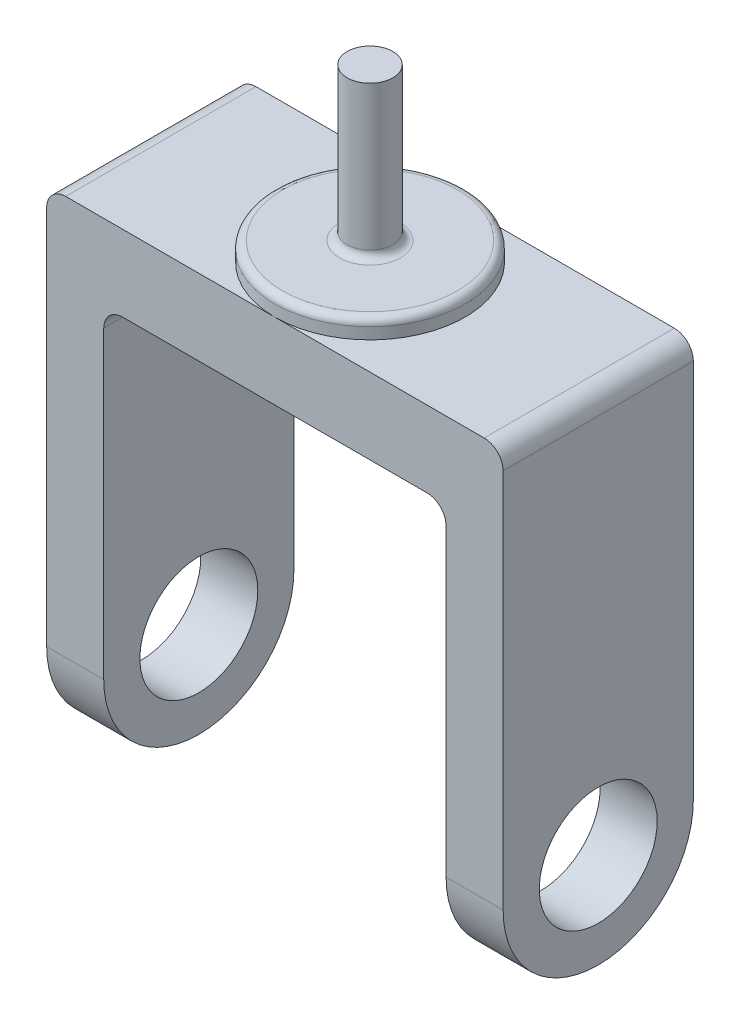
ISO-10303-21;
HEADER;
FILE_DESCRIPTION(('STEP AP214'),'2;1');
FILE_NAME('part.step','',(''),(''),'','','');
FILE_SCHEMA(('AUTOMOTIVE_DESIGN { 1 0 10303 214 1 1 1 1 }'));
ENDSEC;
DATA;
#1=APPLICATION_CONTEXT('core data for automotive mechanical design processes');
#2=APPLICATION_PROTOCOL_DEFINITION('international standard','automotive_design',2000,#1);
#3=PRODUCT_CONTEXT('',#1,'mechanical');
#4=PRODUCT('Part','Part','',(#3));
#5=PRODUCT_RELATED_PRODUCT_CATEGORY('part','',(#4));
#6=PRODUCT_DEFINITION_FORMATION('','',#4);
#7=PRODUCT_DEFINITION_CONTEXT('part definition',#1,'design');
#8=PRODUCT_DEFINITION('design','',#6,#7);
#9=PRODUCT_DEFINITION_SHAPE('','',#8);
#10=(LENGTH_UNIT() NAMED_UNIT(*) SI_UNIT(.MILLI.,.METRE.));
#11=(NAMED_UNIT(*) PLANE_ANGLE_UNIT() SI_UNIT($,.RADIAN.));
#12=(NAMED_UNIT(*) SI_UNIT($,.STERADIAN.) SOLID_ANGLE_UNIT());
#13=UNCERTAINTY_MEASURE_WITH_UNIT(LENGTH_MEASURE(1.E-05),#10,'distance_accuracy_value','');
#14=(GEOMETRIC_REPRESENTATION_CONTEXT(3) GLOBAL_UNCERTAINTY_ASSIGNED_CONTEXT((#13)) GLOBAL_UNIT_ASSIGNED_CONTEXT((#10,
#11,#12)) REPRESENTATION_CONTEXT('',''));
#15=CARTESIAN_POINT('',(0.,0.,0.));
#16=DIRECTION('',(0.,0.,1.));
#17=DIRECTION('',(1.,0.,0.));
#18=AXIS2_PLACEMENT_3D('',#15,#16,#17);
#19=CARTESIAN_POINT('',(0.,138.751233612094,50.));
#20=DIRECTION('',(0.,1.,0.));
#21=DIRECTION('',(0.,0.,1.));
#22=AXIS2_PLACEMENT_3D('',#19,#20,#21);
#23=PLANE('',#22);
#24=DIRECTION('',(1.,0.,0.));
#25=VECTOR('',#24,1.);
#26=CARTESIAN_POINT('',(0.,138.751233612094,50.));
#27=LINE('',#26,#25);
#28=CARTESIAN_POINT('',(60.,138.751233612094,50.));
#29=VERTEX_POINT('',#28);
#30=CARTESIAN_POINT('',(115.,138.751233612094,50.));
#31=VERTEX_POINT('',#30);
#32=EDGE_CURVE('E154',#29,#31,#27,.T.);
#33=ORIENTED_EDGE('',*,*,#32,.T.);
#34=DIRECTION('',(0.,0.,-1.));
#35=VECTOR('',#34,1.);
#36=CARTESIAN_POINT('',(115.,138.751233612094,0.));
#37=LINE('',#36,#35);
#38=CARTESIAN_POINT('',(115.,138.751233612094,0.));
#39=VERTEX_POINT('',#38);
#40=EDGE_CURVE('E272',#31,#39,#37,.T.);
#41=ORIENTED_EDGE('',*,*,#40,.T.);
#42=DIRECTION('',(1.,0.,0.));
#43=VECTOR('',#42,1.);
#44=CARTESIAN_POINT('',(0.,138.751233612094,0.));
#45=LINE('',#44,#43);
#46=CARTESIAN_POINT('',(60.,138.751233612094,0.));
#47=VERTEX_POINT('',#46);
#48=EDGE_CURVE('E169',#47,#39,#45,.T.);
#49=ORIENTED_EDGE('',*,*,#48,.F.);
#50=CARTESIAN_POINT('',(60.,138.751233612094,25.));
#51=DIRECTION('',(0.,1.,0.));
#52=DIRECTION('',(0.,0.,1.));
#53=AXIS2_PLACEMENT_3D('',#50,#51,#52);
#54=CIRCLE('',#53,25.);
#55=EDGE_CURVE('E167',#29,#47,#54,.T.);
#56=ORIENTED_EDGE('',*,*,#55,.F.);
#57=EDGE_LOOP('',(#33,#41,#49,#56));
#58=FACE_BOUND('',#57,.T.);
#59=ADVANCED_FACE('F35',(#58),#23,.T.);
#60=CARTESIAN_POINT('',(0.,33.7512336120935,25.));
#61=DIRECTION('',(1.,0.,0.));
#62=DIRECTION('',(0.,0.,-1.));
#63=AXIS2_PLACEMENT_3D('',#60,#61,#62);
#64=CYLINDRICAL_SURFACE('',#63,25.);
#65=DIRECTION('',(-1.,0.,0.));
#66=VECTOR('',#65,1.);
#67=CARTESIAN_POINT('',(0.,33.7512336120935,0.));
#68=LINE('',#67,#66);
#69=CARTESIAN_POINT('',(120.,33.7512336120935,0.));
#70=VERTEX_POINT('',#69);
#71=CARTESIAN_POINT('',(105.,33.7512336120935,0.));
#72=VERTEX_POINT('',#71);
#73=EDGE_CURVE('E247',#70,#72,#68,.T.);
#74=ORIENTED_EDGE('',*,*,#73,.F.);
#75=CARTESIAN_POINT('',(120.,33.7512336120935,25.));
#76=DIRECTION('',(-1.,0.,0.));
#77=DIRECTION('',(0.,0.,1.));
#78=AXIS2_PLACEMENT_3D('',#75,#76,#77);
#79=CIRCLE('',#78,25.);
#80=CARTESIAN_POINT('',(120.,8.75123361209354,25.));
#81=VERTEX_POINT('',#80);
#82=EDGE_CURVE('E180',#81,#70,#79,.F.);
#83=ORIENTED_EDGE('',*,*,#82,.F.);
#84=DIRECTION('',(1.,0.,0.));
#85=VECTOR('',#84,1.);
#86=CARTESIAN_POINT('',(0.,8.75123361209354,25.));
#87=LINE('',#86,#85);
#88=CARTESIAN_POINT('',(105.,8.75123361209354,25.));
#89=VERTEX_POINT('',#88);
#90=EDGE_CURVE('E238',#81,#89,#87,.F.);
#91=ORIENTED_EDGE('',*,*,#90,.T.);
#92=CARTESIAN_POINT('',(105.,33.7512336120935,25.));
#93=DIRECTION('',(1.,0.,0.));
#94=DIRECTION('',(0.,1.,0.));
#95=AXIS2_PLACEMENT_3D('',#92,#93,#94);
#96=CIRCLE('',#95,25.);
#97=EDGE_CURVE('E176',#72,#89,#96,.F.);
#98=ORIENTED_EDGE('',*,*,#97,.F.);
#99=EDGE_LOOP('',(#74,#83,#91,#98));
#100=FACE_BOUND('',#99,.T.);
#101=ADVANCED_FACE('F341',(#100),#64,.T.);
#102=CARTESIAN_POINT('',(0.,33.7512336120935,25.));
#103=DIRECTION('',(1.,0.,0.));
#104=DIRECTION('',(0.,0.,-1.));
#105=AXIS2_PLACEMENT_3D('',#102,#103,#104);
#106=CYLINDRICAL_SURFACE('',#105,25.);
#107=DIRECTION('',(1.,0.,0.));
#108=VECTOR('',#107,1.);
#109=CARTESIAN_POINT('',(0.,33.7512336120935,50.));
#110=LINE('',#109,#108);
#111=CARTESIAN_POINT('',(105.,33.7512336120935,50.));
#112=VERTEX_POINT('',#111);
#113=CARTESIAN_POINT('',(120.,33.7512336120935,50.));
#114=VERTEX_POINT('',#113);
#115=EDGE_CURVE('E235',#112,#114,#110,.T.);
#116=ORIENTED_EDGE('',*,*,#115,.F.);
#117=CARTESIAN_POINT('',(105.,33.7512336120935,25.));
#118=DIRECTION('',(1.,0.,0.));
#119=DIRECTION('',(0.,1.,0.));
#120=AXIS2_PLACEMENT_3D('',#117,#118,#119);
#121=CIRCLE('',#120,25.);
#122=EDGE_CURVE('E241',#89,#112,#121,.F.);
#123=ORIENTED_EDGE('',*,*,#122,.F.);
#124=ORIENTED_EDGE('',*,*,#90,.F.);
#125=CARTESIAN_POINT('',(120.,33.7512336120935,25.));
#126=DIRECTION('',(-1.,0.,0.));
#127=DIRECTION('',(0.,0.,1.));
#128=AXIS2_PLACEMENT_3D('',#125,#126,#127);
#129=CIRCLE('',#128,25.);
#130=EDGE_CURVE('E244',#114,#81,#129,.F.);
#131=ORIENTED_EDGE('',*,*,#130,.F.);
#132=EDGE_LOOP('',(#116,#123,#124,#131));
#133=FACE_BOUND('',#132,.T.);
#134=ADVANCED_FACE('F304',(#133),#106,.T.);
#135=CARTESIAN_POINT('',(0.,33.7512336120935,25.));
#136=DIRECTION('',(-1.,0.,0.));
#137=DIRECTION('',(0.,0.,1.));
#138=AXIS2_PLACEMENT_3D('',#135,#136,#137);
#139=CYLINDRICAL_SURFACE('',#138,25.);
#140=DIRECTION('',(-1.,0.,0.));
#141=VECTOR('',#140,1.);
#142=CARTESIAN_POINT('',(0.,33.7512336120935,0.));
#143=LINE('',#142,#141);
#144=CARTESIAN_POINT('',(15.,33.7512336120935,0.));
#145=VERTEX_POINT('',#144);
#146=CARTESIAN_POINT('',(0.,33.7512336120935,0.));
#147=VERTEX_POINT('',#146);
#148=EDGE_CURVE('E227',#145,#147,#143,.T.);
#149=ORIENTED_EDGE('',*,*,#148,.F.);
#150=CARTESIAN_POINT('',(15.,33.7512336120935,25.));
#151=DIRECTION('',(1.,0.,0.));
#152=DIRECTION('',(0.,1.,0.));
#153=AXIS2_PLACEMENT_3D('',#150,#151,#152);
#154=CIRCLE('',#153,25.);
#155=CARTESIAN_POINT('',(15.,8.75123361209351,25.));
#156=VERTEX_POINT('',#155);
#157=EDGE_CURVE('E230',#156,#145,#154,.T.);
#158=ORIENTED_EDGE('',*,*,#157,.F.);
#159=DIRECTION('',(1.,0.,0.));
#160=VECTOR('',#159,1.);
#161=CARTESIAN_POINT('',(0.,8.75123361209351,25.));
#162=LINE('',#161,#160);
#163=CARTESIAN_POINT('',(0.,8.75123361209351,25.));
#164=VERTEX_POINT('',#163);
#165=EDGE_CURVE('E222',#156,#164,#162,.F.);
#166=ORIENTED_EDGE('',*,*,#165,.T.);
#167=CARTESIAN_POINT('',(0.,33.7512336120935,25.));
#168=DIRECTION('',(-1.,0.,0.));
#169=DIRECTION('',(0.,0.,1.));
#170=AXIS2_PLACEMENT_3D('',#167,#168,#169);
#171=CIRCLE('',#170,25.);
#172=EDGE_CURVE('E233',#147,#164,#171,.T.);
#173=ORIENTED_EDGE('',*,*,#172,.F.);
#174=EDGE_LOOP('',(#149,#158,#166,#173));
#175=FACE_BOUND('',#174,.T.);
#176=ADVANCED_FACE('F333',(#175),#139,.T.);
#177=CARTESIAN_POINT('',(0.,33.7512336120935,25.));
#178=DIRECTION('',(-1.,0.,0.));
#179=DIRECTION('',(0.,0.,1.));
#180=AXIS2_PLACEMENT_3D('',#177,#178,#179);
#181=CYLINDRICAL_SURFACE('',#180,25.);
#182=DIRECTION('',(1.,0.,0.));
#183=VECTOR('',#182,1.);
#184=CARTESIAN_POINT('',(0.,33.7512336120935,50.));
#185=LINE('',#184,#183);
#186=CARTESIAN_POINT('',(0.,33.7512336120935,50.));
#187=VERTEX_POINT('',#186);
#188=CARTESIAN_POINT('',(15.,33.7512336120935,50.));
#189=VERTEX_POINT('',#188);
#190=EDGE_CURVE('E204',#187,#189,#185,.T.);
#191=ORIENTED_EDGE('',*,*,#190,.F.);
#192=CARTESIAN_POINT('',(0.,33.7512336120935,25.));
#193=DIRECTION('',(-1.,0.,0.));
#194=DIRECTION('',(0.,0.,1.));
#195=AXIS2_PLACEMENT_3D('',#192,#193,#194);
#196=CIRCLE('',#195,25.);
#197=EDGE_CURVE('E225',#164,#187,#196,.T.);
#198=ORIENTED_EDGE('',*,*,#197,.F.);
#199=ORIENTED_EDGE('',*,*,#165,.F.);
#200=CARTESIAN_POINT('',(15.,33.7512336120935,25.));
#201=DIRECTION('',(1.,0.,0.));
#202=DIRECTION('',(0.,1.,0.));
#203=AXIS2_PLACEMENT_3D('',#200,#201,#202);
#204=CIRCLE('',#203,25.);
#205=EDGE_CURVE('E219',#189,#156,#204,.T.);
#206=ORIENTED_EDGE('',*,*,#205,.F.);
#207=EDGE_LOOP('',(#191,#198,#199,#206));
#208=FACE_BOUND('',#207,.T.);
#209=ADVANCED_FACE('F324',(#208),#181,.T.);
#210=CARTESIAN_POINT('',(0.,118.751233612094,50.));
#211=DIRECTION('',(0.,1.,0.));
#212=DIRECTION('',(0.,0.,1.));
#213=AXIS2_PLACEMENT_3D('',#210,#211,#212);
#214=PLANE('',#213);
#215=DIRECTION('',(1.,0.,0.));
#216=VECTOR('',#215,1.);
#217=CARTESIAN_POINT('',(0.,118.751233612094,50.));
#218=LINE('',#217,#216);
#219=CARTESIAN_POINT('',(20.,118.751233612094,50.));
#220=VERTEX_POINT('',#219);
#221=CARTESIAN_POINT('',(100.,118.751233612094,50.));
#222=VERTEX_POINT('',#221);
#223=EDGE_CURVE('E194',#220,#222,#218,.T.);
#224=ORIENTED_EDGE('',*,*,#223,.F.);
#225=DIRECTION('',(0.,0.,-1.));
#226=VECTOR('',#225,1.);
#227=CARTESIAN_POINT('',(20.,118.751233612094,50.));
#228=LINE('',#227,#226);
#229=CARTESIAN_POINT('',(20.,118.751233612094,0.));
#230=VERTEX_POINT('',#229);
#231=EDGE_CURVE('E277',#220,#230,#228,.T.);
#232=ORIENTED_EDGE('',*,*,#231,.T.);
#233=DIRECTION('',(1.,0.,0.));
#234=VECTOR('',#233,1.);
#235=CARTESIAN_POINT('',(0.,118.751233612094,0.));
#236=LINE('',#235,#234);
#237=CARTESIAN_POINT('',(100.,118.751233612094,0.));
#238=VERTEX_POINT('',#237);
#239=EDGE_CURVE('E193',#230,#238,#236,.T.);
#240=ORIENTED_EDGE('',*,*,#239,.T.);
#241=DIRECTION('',(0.,0.,-1.));
#242=VECTOR('',#241,1.);
#243=CARTESIAN_POINT('',(100.,118.751233612094,50.));
#244=LINE('',#243,#242);
#245=EDGE_CURVE('E50',#238,#222,#244,.F.);
#246=ORIENTED_EDGE('',*,*,#245,.T.);
#247=EDGE_LOOP('',(#224,#232,#240,#246));
#248=FACE_BOUND('',#247,.T.);
#249=ADVANCED_FACE('F293',(#248),#214,.F.);
#250=CARTESIAN_POINT('',(105.,0.,50.));
#251=DIRECTION('',(1.,0.,0.));
#252=DIRECTION('',(0.,1.,0.));
#253=AXIS2_PLACEMENT_3D('',#250,#251,#252);
#254=PLANE('',#253);
#255=CARTESIAN_POINT('',(105.,33.7512336120936,25.));
#256=DIRECTION('',(1.,0.,0.));
#257=DIRECTION('',(0.,1.,0.));
#258=AXIS2_PLACEMENT_3D('',#255,#256,#257);
#259=CIRCLE('',#258,15.5);
#260=CARTESIAN_POINT('',(105.,33.7512336120936,9.5));
#261=VERTEX_POINT('',#260);
#262=EDGE_CURVE('E190',#261,#261,#259,.T.);
#263=ORIENTED_EDGE('',*,*,#262,.T.);
#264=EDGE_LOOP('',(#263));
#265=FACE_BOUND('',#264,.T.);
#266=DIRECTION('',(0.,-1.,0.));
#267=VECTOR('',#266,1.);
#268=CARTESIAN_POINT('',(105.,0.,50.));
#269=LINE('',#268,#267);
#270=CARTESIAN_POINT('',(105.,113.751233612094,50.));
#271=VERTEX_POINT('',#270);
#272=EDGE_CURVE('E196',#271,#112,#269,.T.);
#273=ORIENTED_EDGE('',*,*,#272,.F.);
#274=DIRECTION('',(0.,0.,-1.));
#275=VECTOR('',#274,1.);
#276=CARTESIAN_POINT('',(105.,113.751233612094,0.));
#277=LINE('',#276,#275);
#278=CARTESIAN_POINT('',(105.,113.751233612094,0.));
#279=VERTEX_POINT('',#278);
#280=EDGE_CURVE('E282',#271,#279,#277,.T.);
#281=ORIENTED_EDGE('',*,*,#280,.T.);
#282=DIRECTION('',(0.,-1.,0.));
#283=VECTOR('',#282,1.);
#284=CARTESIAN_POINT('',(105.,0.,0.));
#285=LINE('',#284,#283);
#286=EDGE_CURVE('E206',#279,#72,#285,.T.);
#287=ORIENTED_EDGE('',*,*,#286,.T.);
#288=ORIENTED_EDGE('',*,*,#97,.T.);
#289=ORIENTED_EDGE('',*,*,#122,.T.);
#290=EDGE_LOOP('',(#273,#281,#287,#288,#289));
#291=FACE_BOUND('',#290,.T.);
#292=ADVANCED_FACE('F298',(#265,#291),#254,.F.);
#293=CARTESIAN_POINT('',(120.,0.,50.));
#294=DIRECTION('',(-1.,0.,0.));
#295=DIRECTION('',(0.,0.,1.));
#296=AXIS2_PLACEMENT_3D('',#293,#294,#295);
#297=PLANE('',#296);
#298=CARTESIAN_POINT('',(120.,33.7512336120936,25.));
#299=DIRECTION('',(1.,0.,0.));
#300=DIRECTION('',(0.,0.,-1.));
#301=AXIS2_PLACEMENT_3D('',#298,#299,#300);
#302=CIRCLE('',#301,15.5);
#303=CARTESIAN_POINT('',(120.,33.7512336120936,9.5));
#304=VERTEX_POINT('',#303);
#305=EDGE_CURVE('E171',#304,#304,#302,.T.);
#306=ORIENTED_EDGE('',*,*,#305,.F.);
#307=EDGE_LOOP('',(#306));
#308=FACE_BOUND('',#307,.T.);
#309=DIRECTION('',(0.,1.,0.));
#310=VECTOR('',#309,1.);
#311=CARTESIAN_POINT('',(120.,0.,0.));
#312=LINE('',#311,#310);
#313=CARTESIAN_POINT('',(120.,133.751233612094,0.));
#314=VERTEX_POINT('',#313);
#315=EDGE_CURVE('E208',#70,#314,#312,.T.);
#316=ORIENTED_EDGE('',*,*,#315,.T.);
#317=DIRECTION('',(0.,0.,-1.));
#318=VECTOR('',#317,1.);
#319=CARTESIAN_POINT('',(120.,133.751233612094,50.));
#320=LINE('',#319,#318);
#321=CARTESIAN_POINT('',(120.,133.751233612094,50.));
#322=VERTEX_POINT('',#321);
#323=EDGE_CURVE('E274',#314,#322,#320,.F.);
#324=ORIENTED_EDGE('',*,*,#323,.T.);
#325=DIRECTION('',(0.,1.,0.));
#326=VECTOR('',#325,1.);
#327=CARTESIAN_POINT('',(120.,0.,50.));
#328=LINE('',#327,#326);
#329=EDGE_CURVE('E165',#114,#322,#328,.T.);
#330=ORIENTED_EDGE('',*,*,#329,.F.);
#331=ORIENTED_EDGE('',*,*,#130,.T.);
#332=ORIENTED_EDGE('',*,*,#82,.T.);
#333=EDGE_LOOP('',(#316,#324,#330,#331,#332));
#334=FACE_BOUND('',#333,.T.);
#335=ADVANCED_FACE('F307',(#308,#334),#297,.F.);
#336=CARTESIAN_POINT('',(5.,138.751233612094,0.));
#337=VERTEX_POINT('',#336);
#338=EDGE_CURVE('E211',#337,#47,#45,.T.);
#339=ORIENTED_EDGE('',*,*,#338,.F.);
#340=DIRECTION('',(0.,0.,-1.));
#341=VECTOR('',#340,1.);
#342=CARTESIAN_POINT('',(5.,138.751233612094,50.));
#343=LINE('',#342,#341);
#344=CARTESIAN_POINT('',(5.,138.751233612094,50.));
#345=VERTEX_POINT('',#344);
#346=EDGE_CURVE('E151',#337,#345,#343,.F.);
#347=ORIENTED_EDGE('',*,*,#346,.T.);
#348=EDGE_CURVE('E143',#345,#29,#27,.T.);
#349=ORIENTED_EDGE('',*,*,#348,.T.);
#350=EDGE_CURVE('E148',#47,#29,#54,.T.);
#351=ORIENTED_EDGE('',*,*,#350,.F.);
#352=EDGE_LOOP('',(#339,#347,#349,#351));
#353=FACE_BOUND('',#352,.T.);
#354=ADVANCED_FACE('F146',(#353),#23,.T.);
#355=CARTESIAN_POINT('',(0.,0.,50.));
#356=DIRECTION('',(-1.,0.,0.));
#357=DIRECTION('',(0.,0.,1.));
#358=AXIS2_PLACEMENT_3D('',#355,#356,#357);
#359=PLANE('',#358);
#360=CARTESIAN_POINT('',(0.,33.7512336120936,25.));
#361=DIRECTION('',(1.,0.,0.));
#362=DIRECTION('',(0.,0.,-1.));
#363=AXIS2_PLACEMENT_3D('',#360,#361,#362);
#364=CIRCLE('',#363,15.5);
#365=CARTESIAN_POINT('',(0.,33.7512336120936,9.5));
#366=VERTEX_POINT('',#365);
#367=EDGE_CURVE('E184',#366,#366,#364,.T.);
#368=ORIENTED_EDGE('',*,*,#367,.T.);
#369=EDGE_LOOP('',(#368));
#370=FACE_BOUND('',#369,.T.);
#371=DIRECTION('',(0.,1.,0.));
#372=VECTOR('',#371,1.);
#373=CARTESIAN_POINT('',(0.,0.,50.));
#374=LINE('',#373,#372);
#375=CARTESIAN_POINT('',(0.,133.751233612094,50.));
#376=VERTEX_POINT('',#375);
#377=EDGE_CURVE('E153',#187,#376,#374,.T.);
#378=ORIENTED_EDGE('',*,*,#377,.T.);
#379=DIRECTION('',(0.,0.,-1.));
#380=VECTOR('',#379,1.);
#381=CARTESIAN_POINT('',(0.,133.751233612094,50.));
#382=LINE('',#381,#380);
#383=CARTESIAN_POINT('',(0.,133.751233612094,0.));
#384=VERTEX_POINT('',#383);
#385=EDGE_CURVE('E261',#376,#384,#382,.T.);
#386=ORIENTED_EDGE('',*,*,#385,.T.);
#387=DIRECTION('',(0.,1.,0.));
#388=VECTOR('',#387,1.);
#389=CARTESIAN_POINT('',(0.,0.,0.));
#390=LINE('',#389,#388);
#391=EDGE_CURVE('E213',#147,#384,#390,.T.);
#392=ORIENTED_EDGE('',*,*,#391,.F.);
#393=ORIENTED_EDGE('',*,*,#172,.T.);
#394=ORIENTED_EDGE('',*,*,#197,.T.);
#395=EDGE_LOOP('',(#378,#386,#392,#393,#394));
#396=FACE_BOUND('',#395,.T.);
#397=ADVANCED_FACE('F317',(#370,#396),#359,.T.);
#398=CARTESIAN_POINT('',(15.,0.,50.));
#399=DIRECTION('',(1.,0.,0.));
#400=DIRECTION('',(0.,1.,0.));
#401=AXIS2_PLACEMENT_3D('',#398,#399,#400);
#402=PLANE('',#401);
#403=CARTESIAN_POINT('',(15.,33.7512336120936,25.));
#404=DIRECTION('',(1.,0.,0.));
#405=DIRECTION('',(0.,1.,0.));
#406=AXIS2_PLACEMENT_3D('',#403,#404,#405);
#407=CIRCLE('',#406,15.5);
#408=CARTESIAN_POINT('',(15.,33.7512336120936,9.5));
#409=VERTEX_POINT('',#408);
#410=EDGE_CURVE('E187',#409,#409,#407,.T.);
#411=ORIENTED_EDGE('',*,*,#410,.F.);
#412=EDGE_LOOP('',(#411));
#413=FACE_BOUND('',#412,.T.);
#414=DIRECTION('',(0.,-1.,0.));
#415=VECTOR('',#414,1.);
#416=CARTESIAN_POINT('',(15.,0.,0.));
#417=LINE('',#416,#415);
#418=CARTESIAN_POINT('',(15.,113.751233612094,0.));
#419=VERTEX_POINT('',#418);
#420=EDGE_CURVE('E197',#419,#145,#417,.T.);
#421=ORIENTED_EDGE('',*,*,#420,.F.);
#422=DIRECTION('',(0.,0.,-1.));
#423=VECTOR('',#422,1.);
#424=CARTESIAN_POINT('',(15.,113.751233612094,50.));
#425=LINE('',#424,#423);
#426=CARTESIAN_POINT('',(15.,113.751233612094,50.));
#427=VERTEX_POINT('',#426);
#428=EDGE_CURVE('E280',#419,#427,#425,.F.);
#429=ORIENTED_EDGE('',*,*,#428,.T.);
#430=DIRECTION('',(0.,-1.,0.));
#431=VECTOR('',#430,1.);
#432=CARTESIAN_POINT('',(15.,0.,50.));
#433=LINE('',#432,#431);
#434=EDGE_CURVE('E202',#427,#189,#433,.T.);
#435=ORIENTED_EDGE('',*,*,#434,.T.);
#436=ORIENTED_EDGE('',*,*,#205,.T.);
#437=ORIENTED_EDGE('',*,*,#157,.T.);
#438=EDGE_LOOP('',(#421,#429,#435,#436,#437));
#439=FACE_BOUND('',#438,.T.);
#440=ADVANCED_FACE('F330',(#413,#439),#402,.T.);
#441=CARTESIAN_POINT('',(0.,0.,50.));
#442=DIRECTION('',(0.,0.,1.));
#443=DIRECTION('',(1.,0.,0.));
#444=AXIS2_PLACEMENT_3D('',#441,#442,#443);
#445=PLANE('',#444);
#446=ORIENTED_EDGE('',*,*,#348,.F.);
#447=CARTESIAN_POINT('',(5.,133.751233612094,50.));
#448=DIRECTION('',(0.,0.,1.));
#449=DIRECTION('',(1.,0.,0.));
#450=AXIS2_PLACEMENT_3D('',#447,#448,#449);
#451=CIRCLE('',#450,5.);
#452=EDGE_CURVE('E270',#345,#376,#451,.T.);
#453=ORIENTED_EDGE('',*,*,#452,.T.);
#454=ORIENTED_EDGE('',*,*,#377,.F.);
#455=ORIENTED_EDGE('',*,*,#190,.T.);
#456=ORIENTED_EDGE('',*,*,#434,.F.);
#457=CARTESIAN_POINT('',(20.,113.751233612094,50.));
#458=DIRECTION('',(0.,0.,1.));
#459=DIRECTION('',(1.,0.,0.));
#460=AXIS2_PLACEMENT_3D('',#457,#458,#459);
#461=CIRCLE('',#460,5.);
#462=EDGE_CURVE('E57',#427,#220,#461,.F.);
#463=ORIENTED_EDGE('',*,*,#462,.T.);
#464=ORIENTED_EDGE('',*,*,#223,.T.);
#465=CARTESIAN_POINT('',(100.,113.751233612094,50.));
#466=DIRECTION('',(0.,0.,1.));
#467=DIRECTION('',(1.,0.,0.));
#468=AXIS2_PLACEMENT_3D('',#465,#466,#467);
#469=CIRCLE('',#468,5.);
#470=EDGE_CURVE('E11',#222,#271,#469,.F.);
#471=ORIENTED_EDGE('',*,*,#470,.T.);
#472=ORIENTED_EDGE('',*,*,#272,.T.);
#473=ORIENTED_EDGE('',*,*,#115,.T.);
#474=ORIENTED_EDGE('',*,*,#329,.T.);
#475=CARTESIAN_POINT('',(115.,133.751233612094,50.));
#476=DIRECTION('',(0.,0.,1.));
#477=DIRECTION('',(1.,0.,0.));
#478=AXIS2_PLACEMENT_3D('',#475,#476,#477);
#479=CIRCLE('',#478,5.);
#480=EDGE_CURVE('E161',#322,#31,#479,.T.);
#481=ORIENTED_EDGE('',*,*,#480,.T.);
#482=ORIENTED_EDGE('',*,*,#32,.F.);
#483=EDGE_LOOP('',(#446,#453,#454,#455,#456,#463,#464,#471,#472,#473,#474,#481,#482));
#484=FACE_BOUND('',#483,.T.);
#485=ADVANCED_FACE('F158',(#484),#445,.T.);
#486=CARTESIAN_POINT('',(0.,0.,0.));
#487=DIRECTION('',(0.,0.,1.));
#488=DIRECTION('',(1.,0.,0.));
#489=AXIS2_PLACEMENT_3D('',#486,#487,#488);
#490=PLANE('',#489);
#491=ORIENTED_EDGE('',*,*,#391,.T.);
#492=CARTESIAN_POINT('',(5.,133.751233612094,0.));
#493=DIRECTION('',(0.,0.,1.));
#494=DIRECTION('',(1.,0.,0.));
#495=AXIS2_PLACEMENT_3D('',#492,#493,#494);
#496=CIRCLE('',#495,5.);
#497=EDGE_CURVE('E266',#384,#337,#496,.F.);
#498=ORIENTED_EDGE('',*,*,#497,.T.);
#499=ORIENTED_EDGE('',*,*,#338,.T.);
#500=ORIENTED_EDGE('',*,*,#48,.T.);
#501=CARTESIAN_POINT('',(115.,133.751233612094,0.));
#502=DIRECTION('',(0.,0.,1.));
#503=DIRECTION('',(1.,0.,0.));
#504=AXIS2_PLACEMENT_3D('',#501,#502,#503);
#505=CIRCLE('',#504,5.);
#506=EDGE_CURVE('E264',#39,#314,#505,.F.);
#507=ORIENTED_EDGE('',*,*,#506,.T.);
#508=ORIENTED_EDGE('',*,*,#315,.F.);
#509=ORIENTED_EDGE('',*,*,#73,.T.);
#510=ORIENTED_EDGE('',*,*,#286,.F.);
#511=CARTESIAN_POINT('',(100.,113.751233612094,0.));
#512=DIRECTION('',(0.,0.,1.));
#513=DIRECTION('',(1.,0.,0.));
#514=AXIS2_PLACEMENT_3D('',#511,#512,#513);
#515=CIRCLE('',#514,5.);
#516=EDGE_CURVE('E43',#279,#238,#515,.T.);
#517=ORIENTED_EDGE('',*,*,#516,.T.);
#518=ORIENTED_EDGE('',*,*,#239,.F.);
#519=CARTESIAN_POINT('',(20.,113.751233612094,0.));
#520=DIRECTION('',(0.,0.,1.));
#521=DIRECTION('',(1.,0.,0.));
#522=AXIS2_PLACEMENT_3D('',#519,#520,#521);
#523=CIRCLE('',#522,5.);
#524=EDGE_CURVE('E285',#230,#419,#523,.T.);
#525=ORIENTED_EDGE('',*,*,#524,.T.);
#526=ORIENTED_EDGE('',*,*,#420,.T.);
#527=ORIENTED_EDGE('',*,*,#148,.T.);
#528=EDGE_LOOP('',(#491,#498,#499,#500,#507,#508,#509,#510,#517,#518,#525,#526,#527));
#529=FACE_BOUND('',#528,.T.);
#530=ADVANCED_FACE('F290',(#529),#490,.F.);
#531=CARTESIAN_POINT('',(0.,33.7512336120936,25.));
#532=DIRECTION('',(1.,0.,0.));
#533=DIRECTION('',(0.,0.,-1.));
#534=AXIS2_PLACEMENT_3D('',#531,#532,#533);
#535=CYLINDRICAL_SURFACE('',#534,15.5);
#536=CARTESIAN_POINT('',(15.,33.7512336120936,9.5));
#537=CARTESIAN_POINT('',(14.84375,33.7512336120936,9.5));
#538=CARTESIAN_POINT('',(14.6875,33.7512336120936,9.5));
#539=CARTESIAN_POINT('',(14.375,33.7512336120936,9.5));
#540=CARTESIAN_POINT('',(14.21875,33.7512336120936,9.5));
#541=CARTESIAN_POINT('',(13.90625,33.7512336120936,9.5));
#542=CARTESIAN_POINT('',(13.75,33.7512336120936,9.5));
#543=CARTESIAN_POINT('',(13.4375,33.7512336120936,9.5));
#544=CARTESIAN_POINT('',(13.28125,33.7512336120936,9.5));
#545=CARTESIAN_POINT('',(12.96875,33.7512336120936,9.5));
#546=CARTESIAN_POINT('',(12.8125,33.7512336120936,9.5));
#547=CARTESIAN_POINT('',(12.5,33.7512336120936,9.5));
#548=CARTESIAN_POINT('',(12.34375,33.7512336120936,9.5));
#549=CARTESIAN_POINT('',(12.03125,33.7512336120936,9.5));
#550=CARTESIAN_POINT('',(11.875,33.7512336120936,9.5));
#551=CARTESIAN_POINT('',(11.5625,33.7512336120936,9.5));
#552=CARTESIAN_POINT('',(11.40625,33.7512336120936,9.5));
#553=CARTESIAN_POINT('',(11.09375,33.7512336120936,9.5));
#554=CARTESIAN_POINT('',(10.9375,33.7512336120936,9.5));
#555=CARTESIAN_POINT('',(10.625,33.7512336120936,9.5));
#556=CARTESIAN_POINT('',(10.46875,33.7512336120936,9.5));
#557=CARTESIAN_POINT('',(10.15625,33.7512336120936,9.5));
#558=CARTESIAN_POINT('',(10.,33.7512336120936,9.5));
#559=CARTESIAN_POINT('',(9.68750000000001,33.7512336120936,9.5));
#560=CARTESIAN_POINT('',(9.53125000000001,33.7512336120936,9.5));
#561=CARTESIAN_POINT('',(9.21875000000001,33.7512336120936,9.5));
#562=CARTESIAN_POINT('',(9.06250000000001,33.7512336120936,9.5));
#563=CARTESIAN_POINT('',(8.75000000000001,33.7512336120936,9.5));
#564=CARTESIAN_POINT('',(8.59375000000001,33.7512336120936,9.5));
#565=CARTESIAN_POINT('',(8.28125000000001,33.7512336120936,9.5));
#566=CARTESIAN_POINT('',(8.12500000000001,33.7512336120936,9.5));
#567=CARTESIAN_POINT('',(7.81250000000001,33.7512336120936,9.5));
#568=CARTESIAN_POINT('',(7.65625000000001,33.7512336120936,9.5));
#569=CARTESIAN_POINT('',(7.34375000000001,33.7512336120936,9.5));
#570=CARTESIAN_POINT('',(7.18750000000001,33.7512336120936,9.5));
#571=CARTESIAN_POINT('',(6.87500000000001,33.7512336120936,9.5));
#572=CARTESIAN_POINT('',(6.71875000000001,33.7512336120936,9.5));
#573=CARTESIAN_POINT('',(6.40625,33.7512336120936,9.5));
#574=CARTESIAN_POINT('',(6.25,33.7512336120936,9.5));
#575=CARTESIAN_POINT('',(5.9375,33.7512336120936,9.5));
#576=CARTESIAN_POINT('',(5.78125,33.7512336120936,9.5));
#577=CARTESIAN_POINT('',(5.46875,33.7512336120936,9.5));
#578=CARTESIAN_POINT('',(5.3125,33.7512336120936,9.5));
#579=CARTESIAN_POINT('',(5.,33.7512336120936,9.5));
#580=CARTESIAN_POINT('',(4.84375,33.7512336120936,9.5));
#581=CARTESIAN_POINT('',(4.53125,33.7512336120936,9.5));
#582=CARTESIAN_POINT('',(4.375,33.7512336120936,9.5));
#583=CARTESIAN_POINT('',(4.0625,33.7512336120936,9.5));
#584=CARTESIAN_POINT('',(3.90625,33.7512336120936,9.5));
#585=CARTESIAN_POINT('',(3.59375,33.7512336120936,9.5));
#586=CARTESIAN_POINT('',(3.4375,33.7512336120936,9.5));
#587=CARTESIAN_POINT('',(3.125,33.7512336120936,9.5));
#588=CARTESIAN_POINT('',(2.96875,33.7512336120936,9.5));
#589=CARTESIAN_POINT('',(2.65625,33.7512336120936,9.5));
#590=CARTESIAN_POINT('',(2.5,33.7512336120936,9.5));
#591=CARTESIAN_POINT('',(2.1875,33.7512336120936,9.5));
#592=CARTESIAN_POINT('',(2.03125,33.7512336120936,9.5));
#593=CARTESIAN_POINT('',(1.71875,33.7512336120936,9.5));
#594=CARTESIAN_POINT('',(1.5625,33.7512336120936,9.5));
#595=CARTESIAN_POINT('',(1.25,33.7512336120936,9.5));
#596=CARTESIAN_POINT('',(1.09375,33.7512336120936,9.5));
#597=CARTESIAN_POINT('',(0.781250000000001,33.7512336120936,9.5));
#598=CARTESIAN_POINT('',(0.625000000000001,33.7512336120936,9.5));
#599=CARTESIAN_POINT('',(0.3125,33.7512336120936,9.5));
#600=CARTESIAN_POINT('',(0.15625,33.7512336120936,9.5));
#601=CARTESIAN_POINT('',(0.,33.7512336120936,9.5));
#602=B_SPLINE_CURVE_WITH_KNOTS('',3,(#536,#537,#538,#539,#540,#541,#542,#543,#544,#545,#546,
#547,#548,#549,#550,#551,#552,#553,#554,#555,#556,#557,#558,#559,#560,#561,#562,#563,#564,#565,
#566,#567,#568,#569,#570,#571,#572,#573,#574,#575,#576,#577,#578,#579,#580,#581,#582,#583,#584,
#585,#586,#587,#588,#589,#590,#591,#592,#593,#594,#595,#596,#597,#598,#599,#600,#601),
.UNSPECIFIED.,.F.,.F.,(4,2,2,2,2,2,2,2,2,2,2,2,2,2,2,2,2,2,2,2,2,2,2,2,2,2,2,2,2,2,2,2,4),(0.,
0.46875,0.937500000000001,1.40625,1.875,2.34375,2.8125,3.28125,3.75,4.21875,4.6875,5.15625,
5.62500000000001,6.09375000000001,6.56250000000001,7.03125000000001,7.50000000000001,
7.96875000000001,8.43750000000001,8.90625000000001,9.37500000000001,9.84375000000001,10.3125,
10.78125,11.25,11.71875,12.1875,12.65625,13.125,13.59375,14.0625,14.53125,15.),.UNSPECIFIED.);
#603=EDGE_CURVE('BSEAM414',#409,#366,#602,.T.);
#604=ORIENTED_EDGE('',*,*,#410,.T.);
#605=ORIENTED_EDGE('',*,*,#367,.F.);
#606=ORIENTED_EDGE('',*,*,#603,.T.);
#607=ORIENTED_EDGE('',*,*,#603,.F.);
#608=EDGE_LOOP('',(#604,#606,#605,#607));
#609=FACE_BOUND('',#608,.T.);
#610=ADVANCED_FACE('F414',(#609),#535,.F.);
#611=CARTESIAN_POINT('',(120.,33.7512336120936,9.5));
#612=CARTESIAN_POINT('',(119.84375,33.7512336120936,9.5));
#613=CARTESIAN_POINT('',(119.6875,33.7512336120936,9.5));
#614=CARTESIAN_POINT('',(119.375,33.7512336120936,9.5));
#615=CARTESIAN_POINT('',(119.21875,33.7512336120936,9.5));
#616=CARTESIAN_POINT('',(118.90625,33.7512336120936,9.5));
#617=CARTESIAN_POINT('',(118.75,33.7512336120936,9.5));
#618=CARTESIAN_POINT('',(118.4375,33.7512336120936,9.5));
#619=CARTESIAN_POINT('',(118.28125,33.7512336120936,9.5));
#620=CARTESIAN_POINT('',(117.96875,33.7512336120936,9.5));
#621=CARTESIAN_POINT('',(117.8125,33.7512336120936,9.5));
#622=CARTESIAN_POINT('',(117.5,33.7512336120936,9.5));
#623=CARTESIAN_POINT('',(117.34375,33.7512336120936,9.5));
#624=CARTESIAN_POINT('',(117.03125,33.7512336120936,9.5));
#625=CARTESIAN_POINT('',(116.875,33.7512336120936,9.5));
#626=CARTESIAN_POINT('',(116.5625,33.7512336120936,9.5));
#627=CARTESIAN_POINT('',(116.40625,33.7512336120936,9.5));
#628=CARTESIAN_POINT('',(116.09375,33.7512336120936,9.5));
#629=CARTESIAN_POINT('',(115.9375,33.7512336120936,9.5));
#630=CARTESIAN_POINT('',(115.625,33.7512336120936,9.5));
#631=CARTESIAN_POINT('',(115.46875,33.7512336120936,9.5));
#632=CARTESIAN_POINT('',(115.15625,33.7512336120936,9.5));
#633=CARTESIAN_POINT('',(115.,33.7512336120936,9.5));
#634=CARTESIAN_POINT('',(114.6875,33.7512336120936,9.5));
#635=CARTESIAN_POINT('',(114.53125,33.7512336120936,9.5));
#636=CARTESIAN_POINT('',(114.21875,33.7512336120936,9.5));
#637=CARTESIAN_POINT('',(114.0625,33.7512336120936,9.5));
#638=CARTESIAN_POINT('',(113.75,33.7512336120936,9.5));
#639=CARTESIAN_POINT('',(113.59375,33.7512336120936,9.5));
#640=CARTESIAN_POINT('',(113.28125,33.7512336120936,9.5));
#641=CARTESIAN_POINT('',(113.125,33.7512336120936,9.5));
#642=CARTESIAN_POINT('',(112.8125,33.7512336120936,9.5));
#643=CARTESIAN_POINT('',(112.65625,33.7512336120936,9.5));
#644=CARTESIAN_POINT('',(112.34375,33.7512336120936,9.5));
#645=CARTESIAN_POINT('',(112.1875,33.7512336120936,9.5));
#646=CARTESIAN_POINT('',(111.875,33.7512336120936,9.5));
#647=CARTESIAN_POINT('',(111.71875,33.7512336120936,9.5));
#648=CARTESIAN_POINT('',(111.40625,33.7512336120936,9.5));
#649=CARTESIAN_POINT('',(111.25,33.7512336120936,9.5));
#650=CARTESIAN_POINT('',(110.9375,33.7512336120936,9.5));
#651=CARTESIAN_POINT('',(110.78125,33.7512336120936,9.5));
#652=CARTESIAN_POINT('',(110.46875,33.7512336120936,9.5));
#653=CARTESIAN_POINT('',(110.3125,33.7512336120936,9.5));
#654=CARTESIAN_POINT('',(110.,33.7512336120936,9.5));
#655=CARTESIAN_POINT('',(109.84375,33.7512336120936,9.5));
#656=CARTESIAN_POINT('',(109.53125,33.7512336120936,9.5));
#657=CARTESIAN_POINT('',(109.375,33.7512336120936,9.5));
#658=CARTESIAN_POINT('',(109.0625,33.7512336120936,9.5));
#659=CARTESIAN_POINT('',(108.90625,33.7512336120936,9.5));
#660=CARTESIAN_POINT('',(108.59375,33.7512336120936,9.5));
#661=CARTESIAN_POINT('',(108.4375,33.7512336120936,9.5));
#662=CARTESIAN_POINT('',(108.125,33.7512336120936,9.5));
#663=CARTESIAN_POINT('',(107.96875,33.7512336120936,9.5));
#664=CARTESIAN_POINT('',(107.65625,33.7512336120936,9.5));
#665=CARTESIAN_POINT('',(107.5,33.7512336120936,9.5));
#666=CARTESIAN_POINT('',(107.1875,33.7512336120936,9.5));
#667=CARTESIAN_POINT('',(107.03125,33.7512336120936,9.5));
#668=CARTESIAN_POINT('',(106.71875,33.7512336120936,9.5));
#669=CARTESIAN_POINT('',(106.5625,33.7512336120936,9.5));
#670=CARTESIAN_POINT('',(106.25,33.7512336120936,9.5));
#671=CARTESIAN_POINT('',(106.09375,33.7512336120936,9.5));
#672=CARTESIAN_POINT('',(105.78125,33.7512336120936,9.5));
#673=CARTESIAN_POINT('',(105.625,33.7512336120936,9.5));
#674=CARTESIAN_POINT('',(105.3125,33.7512336120936,9.5));
#675=CARTESIAN_POINT('',(105.15625,33.7512336120936,9.5));
#676=CARTESIAN_POINT('',(105.,33.7512336120936,9.5));
#677=B_SPLINE_CURVE_WITH_KNOTS('',3,(#611,#612,#613,#614,#615,#616,#617,#618,#619,#620,#621,
#622,#623,#624,#625,#626,#627,#628,#629,#630,#631,#632,#633,#634,#635,#636,#637,#638,#639,#640,
#641,#642,#643,#644,#645,#646,#647,#648,#649,#650,#651,#652,#653,#654,#655,#656,#657,#658,#659,
#660,#661,#662,#663,#664,#665,#666,#667,#668,#669,#670,#671,#672,#673,#674,#675,#676),
.UNSPECIFIED.,.F.,.F.,(4,2,2,2,2,2,2,2,2,2,2,2,2,2,2,2,2,2,2,2,2,2,2,2,2,2,2,2,2,2,2,2,4),(0.,
0.468750000000004,0.937500000000008,1.40625,1.875,2.34375000000001,2.8125,3.28125,3.75,
4.21875000000001,4.68750000000001,5.15625,5.62500000000001,6.09375000000001,6.5625,7.03125,
7.50000000000001,7.96875000000001,8.43750000000001,8.90625,9.37500000000001,9.84375000000001,
10.3125,10.78125,11.25,11.71875,12.1875,12.65625,13.125,13.59375,14.0625,14.53125,15.),.UNSPECIFIED.);
#678=EDGE_CURVE('BSEAM424',#304,#261,#677,.T.);
#679=ORIENTED_EDGE('',*,*,#305,.T.);
#680=ORIENTED_EDGE('',*,*,#262,.F.);
#681=ORIENTED_EDGE('',*,*,#678,.T.);
#682=ORIENTED_EDGE('',*,*,#678,.F.);
#683=EDGE_LOOP('',(#679,#681,#680,#682));
#684=FACE_BOUND('',#683,.T.);
#685=ADVANCED_FACE('F424',(#684),#535,.F.);
#686=CARTESIAN_POINT('',(60.,143.751233612094,25.));
#687=DIRECTION('',(0.,-1.,0.));
#688=DIRECTION('',(0.,0.,-1.));
#689=AXIS2_PLACEMENT_3D('',#686,#687,#688);
#690=CYLINDRICAL_SURFACE('',#689,25.);
#691=CARTESIAN_POINT('',(60.,141.751233612094,25.));
#692=DIRECTION('',(0.,1.,0.));
#693=DIRECTION('',(0.,0.,1.));
#694=AXIS2_PLACEMENT_3D('',#691,#692,#693);
#695=CIRCLE('',#694,25.);
#696=CARTESIAN_POINT('',(60.,141.751233612094,50.));
#697=VERTEX_POINT('',#696);
#698=EDGE_CURVE('E255',#697,#697,#695,.F.);
#699=ORIENTED_EDGE('',*,*,#698,.T.);
#700=EDGE_LOOP('',(#699));
#701=FACE_BOUND('',#700,.T.);
#702=ORIENTED_EDGE('',*,*,#55,.T.);
#703=ORIENTED_EDGE('',*,*,#350,.T.);
#704=EDGE_LOOP('',(#702,#703));
#705=FACE_BOUND('',#704,.T.);
#706=ADVANCED_FACE('F174',(#701,#705),#690,.T.);
#707=CARTESIAN_POINT('',(60.,143.751233612094,25.));
#708=DIRECTION('',(0.,1.,0.));
#709=DIRECTION('',(0.,0.,1.));
#710=AXIS2_PLACEMENT_3D('',#707,#708,#709);
#711=PLANE('',#710);
#712=CARTESIAN_POINT('',(60.,143.751233612094,25.));
#713=DIRECTION('',(0.,1.,0.));
#714=DIRECTION('',(0.,0.,1.));
#715=AXIS2_PLACEMENT_3D('',#712,#713,#714);
#716=CIRCLE('',#715,23.);
#717=CARTESIAN_POINT('',(60.,143.751233612094,48.));
#718=VERTEX_POINT('',#717);
#719=EDGE_CURVE('E178',#718,#718,#716,.T.);
#720=ORIENTED_EDGE('',*,*,#719,.T.);
#721=EDGE_LOOP('',(#720));
#722=FACE_BOUND('',#721,.T.);
#723=CARTESIAN_POINT('',(60.,143.751233612094,25.));
#724=DIRECTION('',(0.,1.,0.));
#725=DIRECTION('',(0.,0.,1.));
#726=AXIS2_PLACEMENT_3D('',#723,#724,#725);
#727=CIRCLE('',#726,7.99999999999999);
#728=CARTESIAN_POINT('',(60.,143.751233612094,33.));
#729=VERTEX_POINT('',#728);
#730=EDGE_CURVE('E175',#729,#729,#727,.F.);
#731=ORIENTED_EDGE('',*,*,#730,.T.);
#732=EDGE_LOOP('',(#731));
#733=FACE_BOUND('',#732,.T.);
#734=ADVANCED_FACE('F445',(#722,#733),#711,.T.);
#735=CARTESIAN_POINT('',(60.,183.751233612094,25.));
#736=DIRECTION('',(0.,-1.,0.));
#737=DIRECTION('',(0.,0.,-1.));
#738=AXIS2_PLACEMENT_3D('',#735,#736,#737);
#739=CYLINDRICAL_SURFACE('',#738,5.99999999999999);
#740=CARTESIAN_POINT('',(60.,145.751233612094,25.));
#741=DIRECTION('',(0.,1.,0.));
#742=DIRECTION('',(0.,0.,1.));
#743=AXIS2_PLACEMENT_3D('',#740,#741,#742);
#744=CIRCLE('',#743,5.99999999999999);
#745=CARTESIAN_POINT('',(60.,145.751233612094,31.));
#746=VERTEX_POINT('',#745);
#747=EDGE_CURVE('E258',#746,#746,#744,.T.);
#748=ORIENTED_EDGE('',*,*,#747,.T.);
#749=EDGE_LOOP('',(#748));
#750=FACE_BOUND('',#749,.T.);
#751=CARTESIAN_POINT('',(60.,183.751233612094,25.));
#752=DIRECTION('',(0.,1.,0.));
#753=DIRECTION('',(0.,0.,1.));
#754=AXIS2_PLACEMENT_3D('',#751,#752,#753);
#755=CIRCLE('',#754,5.99999999999999);
#756=CARTESIAN_POINT('',(60.,183.751233612094,31.));
#757=VERTEX_POINT('',#756);
#758=EDGE_CURVE('E172',#757,#757,#755,.T.);
#759=ORIENTED_EDGE('',*,*,#758,.F.);
#760=EDGE_LOOP('',(#759));
#761=FACE_BOUND('',#760,.T.);
#762=ADVANCED_FACE('F452',(#750,#761),#739,.T.);
#763=CARTESIAN_POINT('',(60.,183.751233612094,25.));
#764=DIRECTION('',(0.,1.,0.));
#765=DIRECTION('',(0.,0.,1.));
#766=AXIS2_PLACEMENT_3D('',#763,#764,#765);
#767=PLANE('',#766);
#768=ORIENTED_EDGE('',*,*,#758,.T.);
#769=EDGE_LOOP('',(#768));
#770=FACE_BOUND('',#769,.T.);
#771=ADVANCED_FACE('F460',(#770),#767,.T.);
#772=CARTESIAN_POINT('',(60.,141.751233612094,25.));
#773=DIRECTION('',(0.,1.,0.));
#774=DIRECTION('',(0.,0.,1.));
#775=AXIS2_PLACEMENT_3D('',#772,#773,#774);
#776=TOROIDAL_SURFACE('',#775,23.,2.);
#777=ORIENTED_EDGE('',*,*,#698,.F.);
#778=EDGE_LOOP('',(#777));
#779=FACE_BOUND('',#778,.T.);
#780=ORIENTED_EDGE('',*,*,#719,.F.);
#781=EDGE_LOOP('',(#780));
#782=FACE_BOUND('',#781,.T.);
#783=ADVANCED_FACE('F468',(#779,#782),#776,.T.);
#784=CARTESIAN_POINT('',(60.,145.751233612094,25.));
#785=DIRECTION('',(0.,1.,0.));
#786=DIRECTION('',(0.,0.,1.));
#787=AXIS2_PLACEMENT_3D('',#784,#785,#786);
#788=TOROIDAL_SURFACE('',#787,7.99999999999999,2.);
#789=ORIENTED_EDGE('',*,*,#730,.F.);
#790=EDGE_LOOP('',(#789));
#791=FACE_BOUND('',#790,.T.);
#792=ORIENTED_EDGE('',*,*,#747,.F.);
#793=EDGE_LOOP('',(#792));
#794=FACE_BOUND('',#793,.T.);
#795=ADVANCED_FACE('F475',(#791,#794),#788,.F.);
#796=CARTESIAN_POINT('',(5.,133.751233612094,50.));
#797=DIRECTION('',(0.,0.,-1.));
#798=DIRECTION('',(-1.,0.,0.));
#799=AXIS2_PLACEMENT_3D('',#796,#797,#798);
#800=CYLINDRICAL_SURFACE('',#799,5.);
#801=ORIENTED_EDGE('',*,*,#452,.F.);
#802=ORIENTED_EDGE('',*,*,#346,.F.);
#803=ORIENTED_EDGE('',*,*,#497,.F.);
#804=ORIENTED_EDGE('',*,*,#385,.F.);
#805=EDGE_LOOP('',(#801,#802,#803,#804));
#806=FACE_BOUND('',#805,.T.);
#807=ADVANCED_FACE('F313',(#806),#800,.T.);
#808=CARTESIAN_POINT('',(115.,133.751233612094,50.));
#809=DIRECTION('',(0.,0.,1.));
#810=DIRECTION('',(1.,0.,0.));
#811=AXIS2_PLACEMENT_3D('',#808,#809,#810);
#812=CYLINDRICAL_SURFACE('',#811,5.);
#813=ORIENTED_EDGE('',*,*,#480,.F.);
#814=ORIENTED_EDGE('',*,*,#323,.F.);
#815=ORIENTED_EDGE('',*,*,#506,.F.);
#816=ORIENTED_EDGE('',*,*,#40,.F.);
#817=EDGE_LOOP('',(#813,#814,#815,#816));
#818=FACE_BOUND('',#817,.T.);
#819=ADVANCED_FACE('F311',(#818),#812,.T.);
#820=CARTESIAN_POINT('',(20.,113.751233612094,50.));
#821=DIRECTION('',(0.,0.,-1.));
#822=DIRECTION('',(-1.,0.,0.));
#823=AXIS2_PLACEMENT_3D('',#820,#821,#822);
#824=CYLINDRICAL_SURFACE('',#823,5.);
#825=ORIENTED_EDGE('',*,*,#462,.F.);
#826=ORIENTED_EDGE('',*,*,#428,.F.);
#827=ORIENTED_EDGE('',*,*,#524,.F.);
#828=ORIENTED_EDGE('',*,*,#231,.F.);
#829=EDGE_LOOP('',(#825,#826,#827,#828));
#830=FACE_BOUND('',#829,.T.);
#831=ADVANCED_FACE('F328',(#830),#824,.F.);
#832=CARTESIAN_POINT('',(100.,113.751233612094,50.));
#833=DIRECTION('',(0.,0.,1.));
#834=DIRECTION('',(1.,0.,0.));
#835=AXIS2_PLACEMENT_3D('',#832,#833,#834);
#836=CYLINDRICAL_SURFACE('',#835,5.);
#837=ORIENTED_EDGE('',*,*,#470,.F.);
#838=ORIENTED_EDGE('',*,*,#245,.F.);
#839=ORIENTED_EDGE('',*,*,#516,.F.);
#840=ORIENTED_EDGE('',*,*,#280,.F.);
#841=EDGE_LOOP('',(#837,#838,#839,#840));
#842=FACE_BOUND('',#841,.T.);
#843=ADVANCED_FACE('F37',(#842),#836,.F.);
#844=CLOSED_SHELL('',(#59,#101,#134,#176,#209,#249,#292,#335,#354,#397,#440,#485,#530,#610,#685,
#706,#734,#762,#771,#783,#795,#807,#819,#831,#843));
#845=MANIFOLD_SOLID_BREP('B2',#844);
#846=ADVANCED_BREP_SHAPE_REPRESENTATION('',(#18,#845),#14);
#847=SHAPE_DEFINITION_REPRESENTATION(#9,#846);
ENDSEC;
END-ISO-10303-21;
